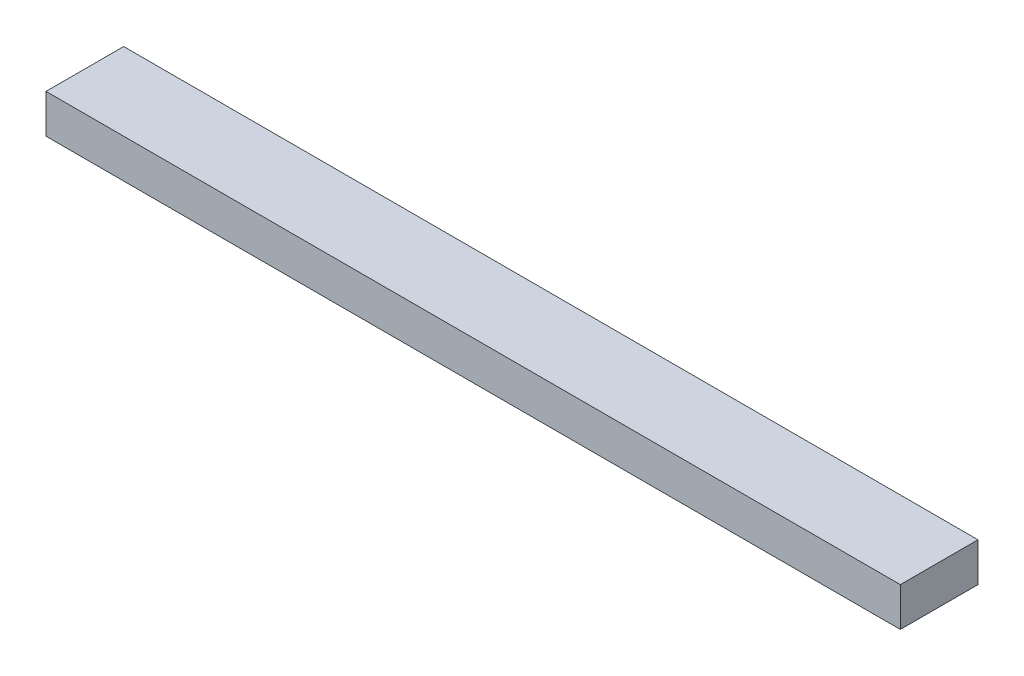
ISO-10303-21;
HEADER;
FILE_DESCRIPTION(('STEP AP214'),'2;1');
FILE_NAME('part.step','',(''),(''),'','','');
FILE_SCHEMA(('AUTOMOTIVE_DESIGN { 1 0 10303 214 1 1 1 1 }'));
ENDSEC;
DATA;
#1=APPLICATION_CONTEXT('core data for automotive mechanical design processes');
#2=APPLICATION_PROTOCOL_DEFINITION('international standard','automotive_design',2000,#1);
#3=PRODUCT_CONTEXT('',#1,'mechanical');
#4=PRODUCT('Part','Part','',(#3));
#5=PRODUCT_RELATED_PRODUCT_CATEGORY('part','',(#4));
#6=PRODUCT_DEFINITION_FORMATION('','',#4);
#7=PRODUCT_DEFINITION_CONTEXT('part definition',#1,'design');
#8=PRODUCT_DEFINITION('design','',#6,#7);
#9=PRODUCT_DEFINITION_SHAPE('','',#8);
#10=(LENGTH_UNIT() NAMED_UNIT(*) SI_UNIT(.MILLI.,.METRE.));
#11=(NAMED_UNIT(*) PLANE_ANGLE_UNIT() SI_UNIT($,.RADIAN.));
#12=(NAMED_UNIT(*) SI_UNIT($,.STERADIAN.) SOLID_ANGLE_UNIT());
#13=UNCERTAINTY_MEASURE_WITH_UNIT(LENGTH_MEASURE(1.E-05),#10,'distance_accuracy_value','');
#14=(GEOMETRIC_REPRESENTATION_CONTEXT(3) GLOBAL_UNCERTAINTY_ASSIGNED_CONTEXT((#13)) GLOBAL_UNIT_ASSIGNED_CONTEXT((#10,
#11,#12)) REPRESENTATION_CONTEXT('',''));
#15=CARTESIAN_POINT('',(0.,0.,0.));
#16=DIRECTION('',(0.,0.,1.));
#17=DIRECTION('',(1.,0.,0.));
#18=AXIS2_PLACEMENT_3D('',#15,#16,#17);
#19=CARTESIAN_POINT('',(55.,5.,5.));
#20=DIRECTION('',(-1.,0.,0.));
#21=DIRECTION('',(0.,0.,1.));
#22=AXIS2_PLACEMENT_3D('',#19,#20,#21);
#23=PLANE('',#22);
#24=DIRECTION('',(0.,0.,-1.));
#25=VECTOR('',#24,1.);
#26=CARTESIAN_POINT('',(55.,0.,5.));
#27=LINE('',#26,#25);
#28=CARTESIAN_POINT('',(55.,0.,5.));
#29=VERTEX_POINT('',#28);
#30=CARTESIAN_POINT('',(55.,0.,-5.));
#31=VERTEX_POINT('',#30);
#32=EDGE_CURVE('E96',#29,#31,#27,.T.);
#33=ORIENTED_EDGE('',*,*,#32,.T.);
#34=DIRECTION('',(0.,-1.,0.));
#35=VECTOR('',#34,1.);
#36=CARTESIAN_POINT('',(55.,5.,-5.));
#37=LINE('',#36,#35);
#38=CARTESIAN_POINT('',(55.,5.,-5.));
#39=VERTEX_POINT('',#38);
#40=EDGE_CURVE('E11',#39,#31,#37,.T.);
#41=ORIENTED_EDGE('',*,*,#40,.F.);
#42=DIRECTION('',(0.,0.,-1.));
#43=VECTOR('',#42,1.);
#44=CARTESIAN_POINT('',(55.,5.,5.));
#45=LINE('',#44,#43);
#46=CARTESIAN_POINT('',(55.,5.,5.));
#47=VERTEX_POINT('',#46);
#48=EDGE_CURVE('E84',#47,#39,#45,.T.);
#49=ORIENTED_EDGE('',*,*,#48,.F.);
#50=DIRECTION('',(0.,-1.,0.));
#51=VECTOR('',#50,1.);
#52=CARTESIAN_POINT('',(55.,5.,5.));
#53=LINE('',#52,#51);
#54=EDGE_CURVE('E92',#47,#29,#53,.T.);
#55=ORIENTED_EDGE('',*,*,#54,.T.);
#56=EDGE_LOOP('',(#33,#41,#49,#55));
#57=FACE_BOUND('',#56,.T.);
#58=ADVANCED_FACE('F33',(#57),#23,.F.);
#59=CARTESIAN_POINT('',(-55.,5.,-5.));
#60=DIRECTION('',(0.,0.,1.));
#61=DIRECTION('',(1.,0.,0.));
#62=AXIS2_PLACEMENT_3D('',#59,#60,#61);
#63=PLANE('',#62);
#64=DIRECTION('',(-1.,0.,0.));
#65=VECTOR('',#64,1.);
#66=CARTESIAN_POINT('',(-55.,0.,-5.));
#67=LINE('',#66,#65);
#68=CARTESIAN_POINT('',(-55.,0.,-5.));
#69=VERTEX_POINT('',#68);
#70=EDGE_CURVE('E88',#31,#69,#67,.T.);
#71=ORIENTED_EDGE('',*,*,#70,.T.);
#72=DIRECTION('',(0.,-1.,0.));
#73=VECTOR('',#72,1.);
#74=CARTESIAN_POINT('',(-55.,5.,-5.));
#75=LINE('',#74,#73);
#76=CARTESIAN_POINT('',(-55.,5.,-5.));
#77=VERTEX_POINT('',#76);
#78=EDGE_CURVE('E41',#77,#69,#75,.T.);
#79=ORIENTED_EDGE('',*,*,#78,.F.);
#80=DIRECTION('',(-1.,0.,0.));
#81=VECTOR('',#80,1.);
#82=CARTESIAN_POINT('',(-55.,5.,-5.));
#83=LINE('',#82,#81);
#84=EDGE_CURVE('E79',#39,#77,#83,.T.);
#85=ORIENTED_EDGE('',*,*,#84,.F.);
#86=ORIENTED_EDGE('',*,*,#40,.T.);
#87=EDGE_LOOP('',(#71,#79,#85,#86));
#88=FACE_BOUND('',#87,.T.);
#89=ADVANCED_FACE('F87',(#88),#63,.F.);
#90=CARTESIAN_POINT('',(-55.,5.,5.));
#91=DIRECTION('',(1.,0.,0.));
#92=DIRECTION('',(0.,0.,-1.));
#93=AXIS2_PLACEMENT_3D('',#90,#91,#92);
#94=PLANE('',#93);
#95=DIRECTION('',(0.,0.,1.));
#96=VECTOR('',#95,1.);
#97=CARTESIAN_POINT('',(-55.,0.,5.));
#98=LINE('',#97,#96);
#99=CARTESIAN_POINT('',(-55.,0.,5.));
#100=VERTEX_POINT('',#99);
#101=EDGE_CURVE('E66',#69,#100,#98,.T.);
#102=ORIENTED_EDGE('',*,*,#101,.T.);
#103=DIRECTION('',(0.,-1.,0.));
#104=VECTOR('',#103,1.);
#105=CARTESIAN_POINT('',(-55.,5.,5.));
#106=LINE('',#105,#104);
#107=CARTESIAN_POINT('',(-55.,5.,5.));
#108=VERTEX_POINT('',#107);
#109=EDGE_CURVE('E89',#108,#100,#106,.T.);
#110=ORIENTED_EDGE('',*,*,#109,.F.);
#111=DIRECTION('',(0.,0.,1.));
#112=VECTOR('',#111,1.);
#113=CARTESIAN_POINT('',(-55.,5.,5.));
#114=LINE('',#113,#112);
#115=EDGE_CURVE('E82',#77,#108,#114,.T.);
#116=ORIENTED_EDGE('',*,*,#115,.F.);
#117=ORIENTED_EDGE('',*,*,#78,.T.);
#118=EDGE_LOOP('',(#102,#110,#116,#117));
#119=FACE_BOUND('',#118,.T.);
#120=ADVANCED_FACE('F90',(#119),#94,.F.);
#121=CARTESIAN_POINT('',(-55.,5.,5.));
#122=DIRECTION('',(0.,0.,-1.));
#123=DIRECTION('',(-1.,0.,0.));
#124=AXIS2_PLACEMENT_3D('',#121,#122,#123);
#125=PLANE('',#124);
#126=DIRECTION('',(1.,0.,0.));
#127=VECTOR('',#126,1.);
#128=CARTESIAN_POINT('',(-55.,0.,5.));
#129=LINE('',#128,#127);
#130=EDGE_CURVE('E72',#100,#29,#129,.T.);
#131=ORIENTED_EDGE('',*,*,#130,.T.);
#132=ORIENTED_EDGE('',*,*,#54,.F.);
#133=DIRECTION('',(1.,0.,0.));
#134=VECTOR('',#133,1.);
#135=CARTESIAN_POINT('',(-55.,5.,5.));
#136=LINE('',#135,#134);
#137=EDGE_CURVE('E49',#108,#47,#136,.T.);
#138=ORIENTED_EDGE('',*,*,#137,.F.);
#139=ORIENTED_EDGE('',*,*,#109,.T.);
#140=EDGE_LOOP('',(#131,#132,#138,#139));
#141=FACE_BOUND('',#140,.T.);
#142=ADVANCED_FACE('F103',(#141),#125,.F.);
#143=CARTESIAN_POINT('',(0.,5.,0.));
#144=DIRECTION('',(0.,-1.,0.));
#145=DIRECTION('',(0.,0.,-1.));
#146=AXIS2_PLACEMENT_3D('',#143,#144,#145);
#147=PLANE('',#146);
#148=ORIENTED_EDGE('',*,*,#48,.T.);
#149=ORIENTED_EDGE('',*,*,#84,.T.);
#150=ORIENTED_EDGE('',*,*,#115,.T.);
#151=ORIENTED_EDGE('',*,*,#137,.T.);
#152=EDGE_LOOP('',(#148,#149,#150,#151));
#153=FACE_BOUND('',#152,.T.);
#154=ADVANCED_FACE('F80',(#153),#147,.F.);
#155=CARTESIAN_POINT('',(0.,0.,0.));
#156=DIRECTION('',(0.,-1.,0.));
#157=DIRECTION('',(0.,0.,-1.));
#158=AXIS2_PLACEMENT_3D('',#155,#156,#157);
#159=PLANE('',#158);
#160=ORIENTED_EDGE('',*,*,#32,.F.);
#161=ORIENTED_EDGE('',*,*,#130,.F.);
#162=ORIENTED_EDGE('',*,*,#101,.F.);
#163=ORIENTED_EDGE('',*,*,#70,.F.);
#164=EDGE_LOOP('',(#160,#161,#162,#163));
#165=FACE_BOUND('',#164,.T.);
#166=ADVANCED_FACE('F106',(#165),#159,.T.);
#167=CLOSED_SHELL('',(#58,#89,#120,#142,#154,#166));
#168=MANIFOLD_SOLID_BREP('B2',#167);
#169=ADVANCED_BREP_SHAPE_REPRESENTATION('',(#18,#168),#14);
#170=SHAPE_DEFINITION_REPRESENTATION(#9,#169);
ENDSEC;
END-ISO-10303-21;
